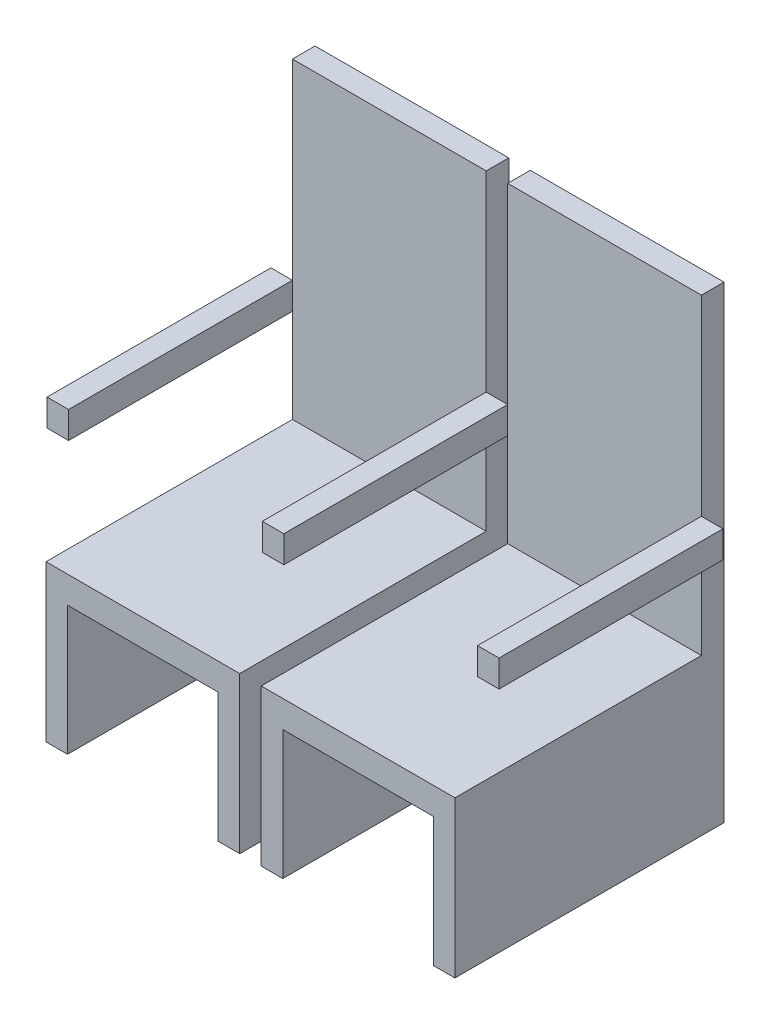
ISO-10303-21;
HEADER;
FILE_DESCRIPTION(('STEP AP214'),'2;1');
FILE_NAME('part.step','',(''),(''),'','','');
FILE_SCHEMA(('AUTOMOTIVE_DESIGN { 1 0 10303 214 1 1 1 1 }'));
ENDSEC;
DATA;
#1=APPLICATION_CONTEXT('core data for automotive mechanical design processes');
#2=APPLICATION_PROTOCOL_DEFINITION('international standard','automotive_design',2000,#1);
#3=PRODUCT_CONTEXT('',#1,'mechanical');
#4=PRODUCT('Part','Part','',(#3));
#5=PRODUCT_RELATED_PRODUCT_CATEGORY('part','',(#4));
#6=PRODUCT_DEFINITION_FORMATION('','',#4);
#7=PRODUCT_DEFINITION_CONTEXT('part definition',#1,'design');
#8=PRODUCT_DEFINITION('design','',#6,#7);
#9=PRODUCT_DEFINITION_SHAPE('','',#8);
#10=(LENGTH_UNIT() NAMED_UNIT(*) SI_UNIT(.MILLI.,.METRE.));
#11=(NAMED_UNIT(*) PLANE_ANGLE_UNIT() SI_UNIT($,.RADIAN.));
#12=(NAMED_UNIT(*) SI_UNIT($,.STERADIAN.) SOLID_ANGLE_UNIT());
#13=UNCERTAINTY_MEASURE_WITH_UNIT(LENGTH_MEASURE(1.E-05),#10,'distance_accuracy_value','');
#14=(GEOMETRIC_REPRESENTATION_CONTEXT(3) GLOBAL_UNCERTAINTY_ASSIGNED_CONTEXT((#13)) GLOBAL_UNIT_ASSIGNED_CONTEXT((#10,
#11,#12)) REPRESENTATION_CONTEXT('',''));
#15=CARTESIAN_POINT('',(0.,0.,0.));
#16=DIRECTION('',(0.,0.,1.));
#17=DIRECTION('',(1.,0.,0.));
#18=AXIS2_PLACEMENT_3D('',#15,#16,#17);
#19=CARTESIAN_POINT('',(0.,0.,-264.16));
#20=DIRECTION('',(0.,0.,-1.));
#21=DIRECTION('',(-1.,0.,0.));
#22=AXIS2_PLACEMENT_3D('',#19,#20,#21);
#23=PLANE('',#22);
#24=DIRECTION('',(0.,-1.,0.));
#25=VECTOR('',#24,1.);
#26=CARTESIAN_POINT('',(-25.4,589.28,-264.16));
#27=LINE('',#26,#25);
#28=CARTESIAN_POINT('',(-25.4,652.78,-264.16));
#29=VERTEX_POINT('',#28);
#30=CARTESIAN_POINT('',(-25.4,589.28,-264.16));
#31=VERTEX_POINT('',#30);
#32=EDGE_CURVE('E93',#29,#31,#27,.T.);
#33=ORIENTED_EDGE('',*,*,#32,.F.);
#34=DIRECTION('',(-1.,0.,0.));
#35=VECTOR('',#34,1.);
#36=CARTESIAN_POINT('',(-25.4,652.78,-264.16));
#37=LINE('',#36,#35);
#38=CARTESIAN_POINT('',(25.4,652.78,-264.16));
#39=VERTEX_POINT('',#38);
#40=EDGE_CURVE('E104',#39,#29,#37,.T.);
#41=ORIENTED_EDGE('',*,*,#40,.F.);
#42=DIRECTION('',(0.,1.,0.));
#43=VECTOR('',#42,1.);
#44=CARTESIAN_POINT('',(25.4,589.28,-264.16));
#45=LINE('',#44,#43);
#46=CARTESIAN_POINT('',(25.4,589.28,-264.16));
#47=VERTEX_POINT('',#46);
#48=EDGE_CURVE('E95',#47,#39,#45,.T.);
#49=ORIENTED_EDGE('',*,*,#48,.F.);
#50=DIRECTION('',(1.,0.,0.));
#51=VECTOR('',#50,1.);
#52=CARTESIAN_POINT('',(-25.4,589.28,-264.16));
#53=LINE('',#52,#51);
#54=EDGE_CURVE('E85',#31,#47,#53,.T.);
#55=ORIENTED_EDGE('',*,*,#54,.F.);
#56=EDGE_LOOP('',(#33,#41,#49,#55));
#57=FACE_BOUND('',#56,.T.);
#58=ADVANCED_FACE('F43',(#57),#23,.T.);
#59=CARTESIAN_POINT('',(-25.4,652.78,345.479677815397));
#60=DIRECTION('',(0.,-1.,0.));
#61=DIRECTION('',(0.,0.,-1.));
#62=AXIS2_PLACEMENT_3D('',#59,#60,#61);
#63=PLANE('',#62);
#64=DIRECTION('',(0.,0.,-1.));
#65=VECTOR('',#64,1.);
#66=CARTESIAN_POINT('',(-25.4,652.78,345.479677815397));
#67=LINE('',#66,#65);
#68=CARTESIAN_POINT('',(-25.4,652.78,264.16));
#69=VERTEX_POINT('',#68);
#70=EDGE_CURVE('E98',#69,#29,#67,.T.);
#71=ORIENTED_EDGE('',*,*,#70,.F.);
#72=DIRECTION('',(1.,0.,0.));
#73=VECTOR('',#72,1.);
#74=CARTESIAN_POINT('',(-25.4,652.78,264.16));
#75=LINE('',#74,#73);
#76=CARTESIAN_POINT('',(25.4,652.78,264.16));
#77=VERTEX_POINT('',#76);
#78=EDGE_CURVE('E47',#69,#77,#75,.T.);
#79=ORIENTED_EDGE('',*,*,#78,.T.);
#80=DIRECTION('',(0.,0.,-1.));
#81=VECTOR('',#80,1.);
#82=CARTESIAN_POINT('',(25.4,652.78,345.479677815397));
#83=LINE('',#82,#81);
#84=EDGE_CURVE('E107',#77,#39,#83,.T.);
#85=ORIENTED_EDGE('',*,*,#84,.T.);
#86=ORIENTED_EDGE('',*,*,#40,.T.);
#87=EDGE_LOOP('',(#71,#79,#85,#86));
#88=FACE_BOUND('',#87,.T.);
#89=ADVANCED_FACE('F116',(#88),#63,.F.);
#90=CARTESIAN_POINT('',(25.4,589.28,345.479677815397));
#91=DIRECTION('',(-1.,0.,0.));
#92=DIRECTION('',(0.,0.,1.));
#93=AXIS2_PLACEMENT_3D('',#90,#91,#92);
#94=PLANE('',#93);
#95=ORIENTED_EDGE('',*,*,#84,.F.);
#96=DIRECTION('',(0.,-1.,0.));
#97=VECTOR('',#96,1.);
#98=CARTESIAN_POINT('',(25.4,589.28,264.159999999999));
#99=LINE('',#98,#97);
#100=CARTESIAN_POINT('',(25.4,589.28,264.159999999999));
#101=VERTEX_POINT('',#100);
#102=EDGE_CURVE('E113',#77,#101,#99,.T.);
#103=ORIENTED_EDGE('',*,*,#102,.T.);
#104=DIRECTION('',(0.,0.,-1.));
#105=VECTOR('',#104,1.);
#106=CARTESIAN_POINT('',(25.4,589.28,345.479677815397));
#107=LINE('',#106,#105);
#108=EDGE_CURVE('E89',#101,#47,#107,.T.);
#109=ORIENTED_EDGE('',*,*,#108,.T.);
#110=ORIENTED_EDGE('',*,*,#48,.T.);
#111=EDGE_LOOP('',(#95,#103,#109,#110));
#112=FACE_BOUND('',#111,.T.);
#113=ADVANCED_FACE('F112',(#112),#94,.F.);
#114=CARTESIAN_POINT('',(-25.4,589.28,345.479677815397));
#115=DIRECTION('',(0.,1.,0.));
#116=DIRECTION('',(0.,0.,1.));
#117=AXIS2_PLACEMENT_3D('',#114,#115,#116);
#118=PLANE('',#117);
#119=ORIENTED_EDGE('',*,*,#108,.F.);
#120=DIRECTION('',(-1.,0.,0.));
#121=VECTOR('',#120,1.);
#122=CARTESIAN_POINT('',(-25.4,589.28,264.16));
#123=LINE('',#122,#121);
#124=CARTESIAN_POINT('',(-25.4,589.28,264.16));
#125=VERTEX_POINT('',#124);
#126=EDGE_CURVE('E52',#101,#125,#123,.T.);
#127=ORIENTED_EDGE('',*,*,#126,.T.);
#128=DIRECTION('',(0.,0.,-1.));
#129=VECTOR('',#128,1.);
#130=CARTESIAN_POINT('',(-25.4,589.28,345.479677815397));
#131=LINE('',#130,#129);
#132=EDGE_CURVE('E82',#125,#31,#131,.T.);
#133=ORIENTED_EDGE('',*,*,#132,.T.);
#134=ORIENTED_EDGE('',*,*,#54,.T.);
#135=EDGE_LOOP('',(#119,#127,#133,#134));
#136=FACE_BOUND('',#135,.T.);
#137=ADVANCED_FACE('F84',(#136),#118,.F.);
#138=CARTESIAN_POINT('',(-25.4,589.28,345.479677815397));
#139=DIRECTION('',(1.,0.,0.));
#140=DIRECTION('',(0.,0.,-1.));
#141=AXIS2_PLACEMENT_3D('',#138,#139,#140);
#142=PLANE('',#141);
#143=ORIENTED_EDGE('',*,*,#132,.F.);
#144=DIRECTION('',(0.,1.,0.));
#145=VECTOR('',#144,1.);
#146=CARTESIAN_POINT('',(-25.4,589.28,264.16));
#147=LINE('',#146,#145);
#148=EDGE_CURVE('E12',#125,#69,#147,.T.);
#149=ORIENTED_EDGE('',*,*,#148,.T.);
#150=ORIENTED_EDGE('',*,*,#70,.T.);
#151=ORIENTED_EDGE('',*,*,#32,.T.);
#152=EDGE_LOOP('',(#143,#149,#150,#151));
#153=FACE_BOUND('',#152,.T.);
#154=ADVANCED_FACE('F45',(#153),#142,.F.);
#155=CARTESIAN_POINT('',(-533.4,368.3,264.16));
#156=DIRECTION('',(0.,0.,-1.));
#157=DIRECTION('',(-1.,0.,0.));
#158=AXIS2_PLACEMENT_3D('',#155,#156,#157);
#159=PLANE('',#158);
#160=ORIENTED_EDGE('',*,*,#126,.F.);
#161=ORIENTED_EDGE('',*,*,#102,.F.);
#162=ORIENTED_EDGE('',*,*,#78,.F.);
#163=ORIENTED_EDGE('',*,*,#148,.F.);
#164=EDGE_LOOP('',(#160,#161,#162,#163));
#165=FACE_BOUND('',#164,.T.);
#166=ADVANCED_FACE('F130',(#165),#159,.F.);
#167=CLOSED_SHELL('',(#58,#89,#113,#137,#154,#166));
#168=MANIFOLD_SOLID_BREP('B2',#167);
#169=CARTESIAN_POINT('',(0.,0.,-264.16));
#170=DIRECTION('',(0.,0.,-1.));
#171=DIRECTION('',(-1.,0.,0.));
#172=AXIS2_PLACEMENT_3D('',#169,#170,#171);
#173=PLANE('',#172);
#174=DIRECTION('',(0.,-1.,0.));
#175=VECTOR('',#174,1.);
#176=CARTESIAN_POINT('',(482.6,589.28,-264.16));
#177=LINE('',#176,#175);
#178=CARTESIAN_POINT('',(482.6,652.78,-264.16));
#179=VERTEX_POINT('',#178);
#180=CARTESIAN_POINT('',(482.6,589.28,-264.16));
#181=VERTEX_POINT('',#180);
#182=EDGE_CURVE('E226',#179,#181,#177,.T.);
#183=ORIENTED_EDGE('',*,*,#182,.F.);
#184=DIRECTION('',(-1.,0.,0.));
#185=VECTOR('',#184,1.);
#186=CARTESIAN_POINT('',(482.6,652.78,-264.16));
#187=LINE('',#186,#185);
#188=CARTESIAN_POINT('',(533.4,652.78,-264.16));
#189=VERTEX_POINT('',#188);
#190=EDGE_CURVE('E237',#189,#179,#187,.T.);
#191=ORIENTED_EDGE('',*,*,#190,.F.);
#192=DIRECTION('',(0.,1.,0.));
#193=VECTOR('',#192,1.);
#194=CARTESIAN_POINT('',(533.4,589.28,-264.16));
#195=LINE('',#194,#193);
#196=CARTESIAN_POINT('',(533.4,589.28,-264.16));
#197=VERTEX_POINT('',#196);
#198=EDGE_CURVE('E228',#197,#189,#195,.T.);
#199=ORIENTED_EDGE('',*,*,#198,.F.);
#200=DIRECTION('',(1.,0.,0.));
#201=VECTOR('',#200,1.);
#202=CARTESIAN_POINT('',(482.6,589.28,-264.16));
#203=LINE('',#202,#201);
#204=EDGE_CURVE('E218',#181,#197,#203,.T.);
#205=ORIENTED_EDGE('',*,*,#204,.F.);
#206=EDGE_LOOP('',(#183,#191,#199,#205));
#207=FACE_BOUND('',#206,.T.);
#208=ADVANCED_FACE('F176',(#207),#173,.T.);
#209=CARTESIAN_POINT('',(482.6,652.78,345.479677815397));
#210=DIRECTION('',(0.,-1.,0.));
#211=DIRECTION('',(0.,0.,-1.));
#212=AXIS2_PLACEMENT_3D('',#209,#210,#211);
#213=PLANE('',#212);
#214=DIRECTION('',(0.,0.,-1.));
#215=VECTOR('',#214,1.);
#216=CARTESIAN_POINT('',(482.6,652.78,345.479677815397));
#217=LINE('',#216,#215);
#218=CARTESIAN_POINT('',(482.6,652.78,264.159999999999));
#219=VERTEX_POINT('',#218);
#220=EDGE_CURVE('E231',#219,#179,#217,.T.);
#221=ORIENTED_EDGE('',*,*,#220,.F.);
#222=DIRECTION('',(1.,0.,0.));
#223=VECTOR('',#222,1.);
#224=CARTESIAN_POINT('',(482.6,652.78,264.159999999999));
#225=LINE('',#224,#223);
#226=CARTESIAN_POINT('',(533.4,652.78,264.159999999999));
#227=VERTEX_POINT('',#226);
#228=EDGE_CURVE('E180',#219,#227,#225,.T.);
#229=ORIENTED_EDGE('',*,*,#228,.T.);
#230=DIRECTION('',(0.,0.,-1.));
#231=VECTOR('',#230,1.);
#232=CARTESIAN_POINT('',(533.4,652.78,345.479677815397));
#233=LINE('',#232,#231);
#234=EDGE_CURVE('E240',#227,#189,#233,.T.);
#235=ORIENTED_EDGE('',*,*,#234,.T.);
#236=ORIENTED_EDGE('',*,*,#190,.T.);
#237=EDGE_LOOP('',(#221,#229,#235,#236));
#238=FACE_BOUND('',#237,.T.);
#239=ADVANCED_FACE('F249',(#238),#213,.F.);
#240=CARTESIAN_POINT('',(533.4,589.28,345.479677815397));
#241=DIRECTION('',(-1.,0.,0.));
#242=DIRECTION('',(0.,0.,1.));
#243=AXIS2_PLACEMENT_3D('',#240,#241,#242);
#244=PLANE('',#243);
#245=ORIENTED_EDGE('',*,*,#234,.F.);
#246=DIRECTION('',(0.,-1.,0.));
#247=VECTOR('',#246,1.);
#248=CARTESIAN_POINT('',(533.4,589.28,264.159999999999));
#249=LINE('',#248,#247);
#250=CARTESIAN_POINT('',(533.4,589.28,264.159999999999));
#251=VERTEX_POINT('',#250);
#252=EDGE_CURVE('E246',#227,#251,#249,.T.);
#253=ORIENTED_EDGE('',*,*,#252,.T.);
#254=DIRECTION('',(0.,0.,-1.));
#255=VECTOR('',#254,1.);
#256=CARTESIAN_POINT('',(533.4,589.28,345.479677815397));
#257=LINE('',#256,#255);
#258=EDGE_CURVE('E222',#251,#197,#257,.T.);
#259=ORIENTED_EDGE('',*,*,#258,.T.);
#260=ORIENTED_EDGE('',*,*,#198,.T.);
#261=EDGE_LOOP('',(#245,#253,#259,#260));
#262=FACE_BOUND('',#261,.T.);
#263=ADVANCED_FACE('F245',(#262),#244,.F.);
#264=CARTESIAN_POINT('',(482.6,589.28,345.479677815397));
#265=DIRECTION('',(0.,1.,0.));
#266=DIRECTION('',(0.,0.,1.));
#267=AXIS2_PLACEMENT_3D('',#264,#265,#266);
#268=PLANE('',#267);
#269=ORIENTED_EDGE('',*,*,#258,.F.);
#270=DIRECTION('',(-1.,0.,0.));
#271=VECTOR('',#270,1.);
#272=CARTESIAN_POINT('',(482.6,589.28,264.159999999999));
#273=LINE('',#272,#271);
#274=CARTESIAN_POINT('',(482.6,589.28,264.159999999999));
#275=VERTEX_POINT('',#274);
#276=EDGE_CURVE('E185',#251,#275,#273,.T.);
#277=ORIENTED_EDGE('',*,*,#276,.T.);
#278=DIRECTION('',(0.,0.,-1.));
#279=VECTOR('',#278,1.);
#280=CARTESIAN_POINT('',(482.6,589.28,345.479677815397));
#281=LINE('',#280,#279);
#282=EDGE_CURVE('E215',#275,#181,#281,.T.);
#283=ORIENTED_EDGE('',*,*,#282,.T.);
#284=ORIENTED_EDGE('',*,*,#204,.T.);
#285=EDGE_LOOP('',(#269,#277,#283,#284));
#286=FACE_BOUND('',#285,.T.);
#287=ADVANCED_FACE('F217',(#286),#268,.F.);
#288=CARTESIAN_POINT('',(482.6,589.28,345.479677815397));
#289=DIRECTION('',(1.,0.,0.));
#290=DIRECTION('',(0.,0.,-1.));
#291=AXIS2_PLACEMENT_3D('',#288,#289,#290);
#292=PLANE('',#291);
#293=ORIENTED_EDGE('',*,*,#282,.F.);
#294=DIRECTION('',(0.,1.,0.));
#295=VECTOR('',#294,1.);
#296=CARTESIAN_POINT('',(482.6,589.28,264.159999999999));
#297=LINE('',#296,#295);
#298=EDGE_CURVE('E41',#275,#219,#297,.T.);
#299=ORIENTED_EDGE('',*,*,#298,.T.);
#300=ORIENTED_EDGE('',*,*,#220,.T.);
#301=ORIENTED_EDGE('',*,*,#182,.T.);
#302=EDGE_LOOP('',(#293,#299,#300,#301));
#303=FACE_BOUND('',#302,.T.);
#304=ADVANCED_FACE('F178',(#303),#292,.F.);
#305=CARTESIAN_POINT('',(-533.4,368.3,264.16));
#306=DIRECTION('',(0.,0.,-1.));
#307=DIRECTION('',(-1.,0.,0.));
#308=AXIS2_PLACEMENT_3D('',#305,#306,#307);
#309=PLANE('',#308);
#310=ORIENTED_EDGE('',*,*,#276,.F.);
#311=ORIENTED_EDGE('',*,*,#252,.F.);
#312=ORIENTED_EDGE('',*,*,#228,.F.);
#313=ORIENTED_EDGE('',*,*,#298,.F.);
#314=EDGE_LOOP('',(#310,#311,#312,#313));
#315=FACE_BOUND('',#314,.T.);
#316=ADVANCED_FACE('F263',(#315),#309,.F.);
#317=CLOSED_SHELL('',(#208,#239,#263,#287,#304,#316));
#318=MANIFOLD_SOLID_BREP('B6',#317);
#319=CARTESIAN_POINT('',(0.,0.,-264.16));
#320=DIRECTION('',(0.,0.,1.));
#321=DIRECTION('',(1.,0.,0.));
#322=AXIS2_PLACEMENT_3D('',#319,#320,#321);
#323=PLANE('',#322);
#324=DIRECTION('',(0.,1.,0.));
#325=VECTOR('',#324,1.);
#326=CARTESIAN_POINT('',(-482.6,589.28,-264.16));
#327=LINE('',#326,#325);
#328=CARTESIAN_POINT('',(-482.6,589.28,-264.16));
#329=VERTEX_POINT('',#328);
#330=CARTESIAN_POINT('',(-482.6,652.78,-264.16));
#331=VERTEX_POINT('',#330);
#332=EDGE_CURVE('E359',#329,#331,#327,.T.);
#333=ORIENTED_EDGE('',*,*,#332,.F.);
#334=DIRECTION('',(1.,0.,0.));
#335=VECTOR('',#334,1.);
#336=CARTESIAN_POINT('',(-482.6,589.28,-264.16));
#337=LINE('',#336,#335);
#338=CARTESIAN_POINT('',(-533.4,589.28,-264.16));
#339=VERTEX_POINT('',#338);
#340=EDGE_CURVE('E370',#339,#329,#337,.T.);
#341=ORIENTED_EDGE('',*,*,#340,.F.);
#342=DIRECTION('',(0.,-1.,0.));
#343=VECTOR('',#342,1.);
#344=CARTESIAN_POINT('',(-533.4,589.28,-264.16));
#345=LINE('',#344,#343);
#346=CARTESIAN_POINT('',(-533.4,652.78,-264.16));
#347=VERTEX_POINT('',#346);
#348=EDGE_CURVE('E361',#347,#339,#345,.T.);
#349=ORIENTED_EDGE('',*,*,#348,.F.);
#350=DIRECTION('',(-1.,0.,0.));
#351=VECTOR('',#350,1.);
#352=CARTESIAN_POINT('',(-482.6,652.78,-264.16));
#353=LINE('',#352,#351);
#354=EDGE_CURVE('E351',#331,#347,#353,.T.);
#355=ORIENTED_EDGE('',*,*,#354,.F.);
#356=EDGE_LOOP('',(#333,#341,#349,#355));
#357=FACE_BOUND('',#356,.T.);
#358=ADVANCED_FACE('F309',(#357),#323,.F.);
#359=CARTESIAN_POINT('',(-482.6,589.28,345.479677815397));
#360=DIRECTION('',(0.,1.,0.));
#361=DIRECTION('',(0.,0.,1.));
#362=AXIS2_PLACEMENT_3D('',#359,#360,#361);
#363=PLANE('',#362);
#364=DIRECTION('',(0.,0.,-1.));
#365=VECTOR('',#364,1.);
#366=CARTESIAN_POINT('',(-482.6,589.28,345.479677815397));
#367=LINE('',#366,#365);
#368=CARTESIAN_POINT('',(-482.6,589.28,264.16));
#369=VERTEX_POINT('',#368);
#370=EDGE_CURVE('E364',#369,#329,#367,.T.);
#371=ORIENTED_EDGE('',*,*,#370,.F.);
#372=DIRECTION('',(-1.,0.,0.));
#373=VECTOR('',#372,1.);
#374=CARTESIAN_POINT('',(-482.6,589.28,264.16));
#375=LINE('',#374,#373);
#376=CARTESIAN_POINT('',(-533.4,589.28,264.16));
#377=VERTEX_POINT('',#376);
#378=EDGE_CURVE('E313',#369,#377,#375,.T.);
#379=ORIENTED_EDGE('',*,*,#378,.T.);
#380=DIRECTION('',(0.,0.,-1.));
#381=VECTOR('',#380,1.);
#382=CARTESIAN_POINT('',(-533.4,589.28,345.479677815397));
#383=LINE('',#382,#381);
#384=EDGE_CURVE('E373',#377,#339,#383,.T.);
#385=ORIENTED_EDGE('',*,*,#384,.T.);
#386=ORIENTED_EDGE('',*,*,#340,.T.);
#387=EDGE_LOOP('',(#371,#379,#385,#386));
#388=FACE_BOUND('',#387,.T.);
#389=ADVANCED_FACE('F382',(#388),#363,.F.);
#390=CARTESIAN_POINT('',(-533.4,589.28,345.479677815397));
#391=DIRECTION('',(1.,0.,0.));
#392=DIRECTION('',(0.,0.,-1.));
#393=AXIS2_PLACEMENT_3D('',#390,#391,#392);
#394=PLANE('',#393);
#395=ORIENTED_EDGE('',*,*,#384,.F.);
#396=DIRECTION('',(0.,1.,0.));
#397=VECTOR('',#396,1.);
#398=CARTESIAN_POINT('',(-533.4,589.28,264.16));
#399=LINE('',#398,#397);
#400=CARTESIAN_POINT('',(-533.4,652.78,264.16));
#401=VERTEX_POINT('',#400);
#402=EDGE_CURVE('E379',#377,#401,#399,.T.);
#403=ORIENTED_EDGE('',*,*,#402,.T.);
#404=DIRECTION('',(0.,0.,-1.));
#405=VECTOR('',#404,1.);
#406=CARTESIAN_POINT('',(-533.4,652.78,345.479677815397));
#407=LINE('',#406,#405);
#408=EDGE_CURVE('E355',#401,#347,#407,.T.);
#409=ORIENTED_EDGE('',*,*,#408,.T.);
#410=ORIENTED_EDGE('',*,*,#348,.T.);
#411=EDGE_LOOP('',(#395,#403,#409,#410));
#412=FACE_BOUND('',#411,.T.);
#413=ADVANCED_FACE('F378',(#412),#394,.F.);
#414=CARTESIAN_POINT('',(-482.6,652.78,345.479677815397));
#415=DIRECTION('',(0.,-1.,0.));
#416=DIRECTION('',(0.,0.,-1.));
#417=AXIS2_PLACEMENT_3D('',#414,#415,#416);
#418=PLANE('',#417);
#419=ORIENTED_EDGE('',*,*,#408,.F.);
#420=DIRECTION('',(1.,0.,0.));
#421=VECTOR('',#420,1.);
#422=CARTESIAN_POINT('',(-482.6,652.78,264.16));
#423=LINE('',#422,#421);
#424=CARTESIAN_POINT('',(-482.6,652.78,264.16));
#425=VERTEX_POINT('',#424);
#426=EDGE_CURVE('E318',#401,#425,#423,.T.);
#427=ORIENTED_EDGE('',*,*,#426,.T.);
#428=DIRECTION('',(0.,0.,-1.));
#429=VECTOR('',#428,1.);
#430=CARTESIAN_POINT('',(-482.6,652.78,345.479677815397));
#431=LINE('',#430,#429);
#432=EDGE_CURVE('E348',#425,#331,#431,.T.);
#433=ORIENTED_EDGE('',*,*,#432,.T.);
#434=ORIENTED_EDGE('',*,*,#354,.T.);
#435=EDGE_LOOP('',(#419,#427,#433,#434));
#436=FACE_BOUND('',#435,.T.);
#437=ADVANCED_FACE('F350',(#436),#418,.F.);
#438=CARTESIAN_POINT('',(-482.6,589.28,345.479677815397));
#439=DIRECTION('',(-1.,0.,0.));
#440=DIRECTION('',(0.,0.,1.));
#441=AXIS2_PLACEMENT_3D('',#438,#439,#440);
#442=PLANE('',#441);
#443=ORIENTED_EDGE('',*,*,#432,.F.);
#444=DIRECTION('',(0.,-1.,0.));
#445=VECTOR('',#444,1.);
#446=CARTESIAN_POINT('',(-482.6,589.28,264.16));
#447=LINE('',#446,#445);
#448=EDGE_CURVE('E174',#425,#369,#447,.T.);
#449=ORIENTED_EDGE('',*,*,#448,.T.);
#450=ORIENTED_EDGE('',*,*,#370,.T.);
#451=ORIENTED_EDGE('',*,*,#332,.T.);
#452=EDGE_LOOP('',(#443,#449,#450,#451));
#453=FACE_BOUND('',#452,.T.);
#454=ADVANCED_FACE('F311',(#453),#442,.F.);
#455=CARTESIAN_POINT('',(-533.4,368.3,264.16));
#456=DIRECTION('',(0.,0.,-1.));
#457=DIRECTION('',(-1.,0.,0.));
#458=AXIS2_PLACEMENT_3D('',#455,#456,#457);
#459=PLANE('',#458);
#460=ORIENTED_EDGE('',*,*,#426,.F.);
#461=ORIENTED_EDGE('',*,*,#402,.F.);
#462=ORIENTED_EDGE('',*,*,#378,.F.);
#463=ORIENTED_EDGE('',*,*,#448,.F.);
#464=EDGE_LOOP('',(#460,#461,#462,#463));
#465=FACE_BOUND('',#464,.T.);
#466=ADVANCED_FACE('F396',(#465),#459,.F.);
#467=CLOSED_SHELL('',(#358,#389,#413,#437,#454,#466));
#468=MANIFOLD_SOLID_BREP('B35',#467);
#469=CARTESIAN_POINT('',(0.,0.,0.));
#470=DIRECTION('',(0.,-1.,0.));
#471=DIRECTION('',(0.,0.,-1.));
#472=AXIS2_PLACEMENT_3D('',#469,#470,#471);
#473=PLANE('',#472);
#474=DIRECTION('',(0.,0.,1.));
#475=VECTOR('',#474,1.);
#476=CARTESIAN_POINT('',(76.1999999999999,0.,-317.5));
#477=LINE('',#476,#475);
#478=CARTESIAN_POINT('',(76.1999999999999,0.,-317.5));
#479=VERTEX_POINT('',#478);
#480=CARTESIAN_POINT('',(76.1999999999999,0.,317.5));
#481=VERTEX_POINT('',#480);
#482=EDGE_CURVE('E521',#479,#481,#477,.T.);
#483=ORIENTED_EDGE('',*,*,#482,.T.);
#484=DIRECTION('',(1.,0.,0.));
#485=VECTOR('',#484,1.);
#486=CARTESIAN_POINT('',(25.4,0.,317.5));
#487=LINE('',#486,#485);
#488=CARTESIAN_POINT('',(25.4,0.,317.5));
#489=VERTEX_POINT('',#488);
#490=EDGE_CURVE('E550',#489,#481,#487,.T.);
#491=ORIENTED_EDGE('',*,*,#490,.F.);
#492=DIRECTION('',(0.,0.,1.));
#493=VECTOR('',#492,1.);
#494=CARTESIAN_POINT('',(25.4,0.,317.5));
#495=LINE('',#494,#493);
#496=CARTESIAN_POINT('',(25.4,0.,-317.5));
#497=VERTEX_POINT('',#496);
#498=EDGE_CURVE('E543',#497,#489,#495,.T.);
#499=ORIENTED_EDGE('',*,*,#498,.F.);
#500=DIRECTION('',(-1.,0.,0.));
#501=VECTOR('',#500,1.);
#502=CARTESIAN_POINT('',(25.4,0.,-317.5));
#503=LINE('',#502,#501);
#504=EDGE_CURVE('E537',#479,#497,#503,.T.);
#505=ORIENTED_EDGE('',*,*,#504,.F.);
#506=EDGE_LOOP('',(#483,#491,#499,#505));
#507=FACE_BOUND('',#506,.T.);
#508=ADVANCED_FACE('F442',(#507),#473,.T.);
#509=CARTESIAN_POINT('',(0.,368.3,0.));
#510=DIRECTION('',(0.,-1.,0.));
#511=DIRECTION('',(0.,0.,-1.));
#512=AXIS2_PLACEMENT_3D('',#509,#510,#511);
#513=PLANE('',#512);
#514=DIRECTION('',(0.,0.,-1.));
#515=VECTOR('',#514,1.);
#516=CARTESIAN_POINT('',(482.6,368.3,264.16));
#517=LINE('',#516,#515);
#518=CARTESIAN_POINT('',(482.6,368.3,317.5));
#519=VERTEX_POINT('',#518);
#520=CARTESIAN_POINT('',(482.6,368.3,-264.16));
#521=VERTEX_POINT('',#520);
#522=EDGE_CURVE('E557',#519,#521,#517,.T.);
#523=ORIENTED_EDGE('',*,*,#522,.T.);
#524=DIRECTION('',(1.,0.,0.));
#525=VECTOR('',#524,1.);
#526=CARTESIAN_POINT('',(482.6,368.3,-264.16));
#527=LINE('',#526,#525);
#528=CARTESIAN_POINT('',(25.4,368.3,-264.16));
#529=VERTEX_POINT('',#528);
#530=EDGE_CURVE('E586',#529,#521,#527,.T.);
#531=ORIENTED_EDGE('',*,*,#530,.F.);
#532=DIRECTION('',(0.,0.,1.));
#533=VECTOR('',#532,1.);
#534=CARTESIAN_POINT('',(25.4,368.3,317.5));
#535=LINE('',#534,#533);
#536=CARTESIAN_POINT('',(25.4,368.3,317.5));
#537=VERTEX_POINT('',#536);
#538=EDGE_CURVE('E548',#529,#537,#535,.T.);
#539=ORIENTED_EDGE('',*,*,#538,.T.);
#540=DIRECTION('',(1.,0.,0.));
#541=VECTOR('',#540,1.);
#542=CARTESIAN_POINT('',(25.4,368.3,317.5));
#543=LINE('',#542,#541);
#544=EDGE_CURVE('E569',#537,#519,#543,.T.);
#545=ORIENTED_EDGE('',*,*,#544,.T.);
#546=EDGE_LOOP('',(#523,#531,#539,#545));
#547=FACE_BOUND('',#546,.T.);
#548=ADVANCED_FACE('F622',(#547),#513,.F.);
#549=CARTESIAN_POINT('',(25.4,368.3,317.5));
#550=DIRECTION('',(1.,0.,0.));
#551=DIRECTION('',(0.,0.,-1.));
#552=AXIS2_PLACEMENT_3D('',#549,#550,#551);
#553=PLANE('',#552);
#554=ORIENTED_EDGE('',*,*,#498,.T.);
#555=DIRECTION('',(0.,-1.,0.));
#556=VECTOR('',#555,1.);
#557=CARTESIAN_POINT('',(25.4,368.3,317.5));
#558=LINE('',#557,#556);
#559=EDGE_CURVE('E307',#537,#489,#558,.T.);
#560=ORIENTED_EDGE('',*,*,#559,.F.);
#561=ORIENTED_EDGE('',*,*,#538,.F.);
#562=DIRECTION('',(0.,-1.,0.));
#563=VECTOR('',#562,1.);
#564=CARTESIAN_POINT('',(25.4,1104.9,-264.16));
#565=LINE('',#564,#563);
#566=CARTESIAN_POINT('',(25.4,1104.9,-264.16));
#567=VERTEX_POINT('',#566);
#568=EDGE_CURVE('E465',#567,#529,#565,.T.);
#569=ORIENTED_EDGE('',*,*,#568,.F.);
#570=DIRECTION('',(0.,0.,1.));
#571=VECTOR('',#570,1.);
#572=CARTESIAN_POINT('',(25.4,1104.9,-264.16));
#573=LINE('',#572,#571);
#574=CARTESIAN_POINT('',(25.4,1104.9,-317.5));
#575=VERTEX_POINT('',#574);
#576=EDGE_CURVE('E591',#575,#567,#573,.T.);
#577=ORIENTED_EDGE('',*,*,#576,.F.);
#578=DIRECTION('',(0.,-1.,0.));
#579=VECTOR('',#578,1.);
#580=CARTESIAN_POINT('',(25.4,368.3,-317.5));
#581=LINE('',#580,#579);
#582=EDGE_CURVE('E554',#575,#497,#581,.T.);
#583=ORIENTED_EDGE('',*,*,#582,.T.);
#584=EDGE_LOOP('',(#554,#560,#561,#569,#577,#583));
#585=FACE_BOUND('',#584,.T.);
#586=ADVANCED_FACE('F444',(#585),#553,.F.);
#587=CARTESIAN_POINT('',(25.4,368.3,317.5));
#588=DIRECTION('',(0.,0.,-1.));
#589=DIRECTION('',(-1.,0.,0.));
#590=AXIS2_PLACEMENT_3D('',#587,#588,#589);
#591=PLANE('',#590);
#592=ORIENTED_EDGE('',*,*,#490,.T.);
#593=DIRECTION('',(0.,1.,0.));
#594=VECTOR('',#593,1.);
#595=CARTESIAN_POINT('',(76.2,368.3,317.5));
#596=LINE('',#595,#594);
#597=CARTESIAN_POINT('',(76.2,304.8,317.5));
#598=VERTEX_POINT('',#597);
#599=EDGE_CURVE('E528',#481,#598,#596,.T.);
#600=ORIENTED_EDGE('',*,*,#599,.T.);
#601=DIRECTION('',(1.,0.,0.));
#602=VECTOR('',#601,1.);
#603=CARTESIAN_POINT('',(25.4,304.8,317.5));
#604=LINE('',#603,#602);
#605=CARTESIAN_POINT('',(431.8,304.8,317.5));
#606=VERTEX_POINT('',#605);
#607=EDGE_CURVE('E589',#598,#606,#604,.T.);
#608=ORIENTED_EDGE('',*,*,#607,.T.);
#609=DIRECTION('',(0.,-1.,0.));
#610=VECTOR('',#609,1.);
#611=CARTESIAN_POINT('',(431.8,368.3,317.5));
#612=LINE('',#611,#610);
#613=CARTESIAN_POINT('',(431.8,0.,317.5));
#614=VERTEX_POINT('',#613);
#615=EDGE_CURVE('E575',#606,#614,#612,.T.);
#616=ORIENTED_EDGE('',*,*,#615,.T.);
#617=CARTESIAN_POINT('',(482.6,0.,317.5));
#618=VERTEX_POINT('',#617);
#619=EDGE_CURVE('E573',#614,#618,#487,.T.);
#620=ORIENTED_EDGE('',*,*,#619,.T.);
#621=DIRECTION('',(0.,-1.,0.));
#622=VECTOR('',#621,1.);
#623=CARTESIAN_POINT('',(482.6,368.3,317.5));
#624=LINE('',#623,#622);
#625=EDGE_CURVE('E450',#519,#618,#624,.T.);
#626=ORIENTED_EDGE('',*,*,#625,.F.);
#627=ORIENTED_EDGE('',*,*,#544,.F.);
#628=ORIENTED_EDGE('',*,*,#559,.T.);
#629=EDGE_LOOP('',(#592,#600,#608,#616,#620,#626,#627,#628));
#630=FACE_BOUND('',#629,.T.);
#631=ADVANCED_FACE('F568',(#630),#591,.F.);
#632=CARTESIAN_POINT('',(482.6,368.3,-264.16));
#633=DIRECTION('',(-1.,0.,0.));
#634=DIRECTION('',(0.,0.,1.));
#635=AXIS2_PLACEMENT_3D('',#632,#633,#634);
#636=PLANE('',#635);
#637=DIRECTION('',(0.,-1.,0.));
#638=VECTOR('',#637,1.);
#639=CARTESIAN_POINT('',(482.6,1104.9,-264.16));
#640=LINE('',#639,#638);
#641=CARTESIAN_POINT('',(482.6,1104.9,-264.16));
#642=VERTEX_POINT('',#641);
#643=EDGE_CURVE('E583',#642,#521,#640,.T.);
#644=ORIENTED_EDGE('',*,*,#643,.T.);
#645=ORIENTED_EDGE('',*,*,#522,.F.);
#646=ORIENTED_EDGE('',*,*,#625,.T.);
#647=DIRECTION('',(0.,0.,-1.));
#648=VECTOR('',#647,1.);
#649=CARTESIAN_POINT('',(482.6,0.,-264.16));
#650=LINE('',#649,#648);
#651=CARTESIAN_POINT('',(482.6,0.,-317.5));
#652=VERTEX_POINT('',#651);
#653=EDGE_CURVE('E545',#618,#652,#650,.T.);
#654=ORIENTED_EDGE('',*,*,#653,.T.);
#655=DIRECTION('',(0.,-1.,0.));
#656=VECTOR('',#655,1.);
#657=CARTESIAN_POINT('',(482.6,368.3,-317.5));
#658=LINE('',#657,#656);
#659=CARTESIAN_POINT('',(482.6,1104.9,-317.5));
#660=VERTEX_POINT('',#659);
#661=EDGE_CURVE('E556',#660,#652,#658,.T.);
#662=ORIENTED_EDGE('',*,*,#661,.F.);
#663=DIRECTION('',(0.,0.,-1.));
#664=VECTOR('',#663,1.);
#665=CARTESIAN_POINT('',(482.6,1104.9,-264.16));
#666=LINE('',#665,#664);
#667=EDGE_CURVE('E588',#642,#660,#666,.T.);
#668=ORIENTED_EDGE('',*,*,#667,.F.);
#669=EDGE_LOOP('',(#644,#645,#646,#654,#662,#668));
#670=FACE_BOUND('',#669,.T.);
#671=ADVANCED_FACE('F563',(#670),#636,.F.);
#672=CARTESIAN_POINT('',(25.4,368.3,-317.5));
#673=DIRECTION('',(0.,0.,1.));
#674=DIRECTION('',(1.,0.,0.));
#675=AXIS2_PLACEMENT_3D('',#672,#673,#674);
#676=PLANE('',#675);
#677=DIRECTION('',(-1.,0.,0.));
#678=VECTOR('',#677,1.);
#679=CARTESIAN_POINT('',(76.2,304.8,-317.5));
#680=LINE('',#679,#678);
#681=CARTESIAN_POINT('',(431.8,304.8,-317.5));
#682=VERTEX_POINT('',#681);
#683=CARTESIAN_POINT('',(76.2,304.8,-317.5));
#684=VERTEX_POINT('',#683);
#685=EDGE_CURVE('E533',#682,#684,#680,.T.);
#686=ORIENTED_EDGE('',*,*,#685,.T.);
#687=DIRECTION('',(0.,-1.,0.));
#688=VECTOR('',#687,1.);
#689=CARTESIAN_POINT('',(76.1999999999999,0.,-317.5));
#690=LINE('',#689,#688);
#691=EDGE_CURVE('E525',#684,#479,#690,.T.);
#692=ORIENTED_EDGE('',*,*,#691,.T.);
#693=ORIENTED_EDGE('',*,*,#504,.T.);
#694=ORIENTED_EDGE('',*,*,#582,.F.);
#695=DIRECTION('',(-1.,0.,0.));
#696=VECTOR('',#695,1.);
#697=CARTESIAN_POINT('',(482.6,1104.9,-317.5));
#698=LINE('',#697,#696);
#699=EDGE_CURVE('E593',#660,#575,#698,.T.);
#700=ORIENTED_EDGE('',*,*,#699,.F.);
#701=ORIENTED_EDGE('',*,*,#661,.T.);
#702=CARTESIAN_POINT('',(431.8,0.,-317.5));
#703=VERTEX_POINT('',#702);
#704=EDGE_CURVE('E544',#652,#703,#503,.T.);
#705=ORIENTED_EDGE('',*,*,#704,.T.);
#706=DIRECTION('',(0.,1.,0.));
#707=VECTOR('',#706,1.);
#708=CARTESIAN_POINT('',(431.8,0.,-317.5));
#709=LINE('',#708,#707);
#710=EDGE_CURVE('E457',#703,#682,#709,.T.);
#711=ORIENTED_EDGE('',*,*,#710,.T.);
#712=EDGE_LOOP('',(#686,#692,#693,#694,#700,#701,#705,#711));
#713=FACE_BOUND('',#712,.T.);
#714=ADVANCED_FACE('F536',(#713),#676,.F.);
#715=DIRECTION('',(0.,0.,1.));
#716=VECTOR('',#715,1.);
#717=CARTESIAN_POINT('',(431.8,0.,-317.5));
#718=LINE('',#717,#716);
#719=EDGE_CURVE('E532',#703,#614,#718,.T.);
#720=ORIENTED_EDGE('',*,*,#719,.F.);
#721=ORIENTED_EDGE('',*,*,#704,.F.);
#722=ORIENTED_EDGE('',*,*,#653,.F.);
#723=ORIENTED_EDGE('',*,*,#619,.F.);
#724=EDGE_LOOP('',(#720,#721,#722,#723));
#725=FACE_BOUND('',#724,.T.);
#726=ADVANCED_FACE('F609',(#725),#473,.T.);
#727=CARTESIAN_POINT('',(482.6,1104.9,-264.16));
#728=DIRECTION('',(0.,0.,-1.));
#729=DIRECTION('',(-1.,0.,0.));
#730=AXIS2_PLACEMENT_3D('',#727,#728,#729);
#731=PLANE('',#730);
#732=ORIENTED_EDGE('',*,*,#530,.T.);
#733=ORIENTED_EDGE('',*,*,#643,.F.);
#734=DIRECTION('',(1.,0.,0.));
#735=VECTOR('',#734,1.);
#736=CARTESIAN_POINT('',(482.6,1104.9,-264.16));
#737=LINE('',#736,#735);
#738=EDGE_CURVE('E585',#567,#642,#737,.T.);
#739=ORIENTED_EDGE('',*,*,#738,.F.);
#740=ORIENTED_EDGE('',*,*,#568,.T.);
#741=EDGE_LOOP('',(#732,#733,#739,#740));
#742=FACE_BOUND('',#741,.T.);
#743=ADVANCED_FACE('F620',(#742),#731,.F.);
#744=CARTESIAN_POINT('',(0.,1104.9,0.));
#745=DIRECTION('',(0.,1.,0.));
#746=DIRECTION('',(0.,0.,1.));
#747=AXIS2_PLACEMENT_3D('',#744,#745,#746);
#748=PLANE('',#747);
#749=ORIENTED_EDGE('',*,*,#667,.T.);
#750=ORIENTED_EDGE('',*,*,#699,.T.);
#751=ORIENTED_EDGE('',*,*,#576,.T.);
#752=ORIENTED_EDGE('',*,*,#738,.T.);
#753=EDGE_LOOP('',(#749,#750,#751,#752));
#754=FACE_BOUND('',#753,.T.);
#755=ADVANCED_FACE('F617',(#754),#748,.T.);
#756=CARTESIAN_POINT('',(76.2,304.8,-317.5));
#757=DIRECTION('',(0.,1.,0.));
#758=DIRECTION('',(-1.,0.,0.));
#759=AXIS2_PLACEMENT_3D('',#756,#757,#758);
#760=PLANE('',#759);
#761=DIRECTION('',(0.,0.,1.));
#762=VECTOR('',#761,1.);
#763=CARTESIAN_POINT('',(76.2,304.8,-317.5));
#764=LINE('',#763,#762);
#765=EDGE_CURVE('E600',#684,#598,#764,.T.);
#766=ORIENTED_EDGE('',*,*,#765,.F.);
#767=ORIENTED_EDGE('',*,*,#685,.F.);
#768=DIRECTION('',(0.,0.,1.));
#769=VECTOR('',#768,1.);
#770=CARTESIAN_POINT('',(431.8,304.8,-317.5));
#771=LINE('',#770,#769);
#772=EDGE_CURVE('E603',#682,#606,#771,.T.);
#773=ORIENTED_EDGE('',*,*,#772,.T.);
#774=ORIENTED_EDGE('',*,*,#607,.F.);
#775=EDGE_LOOP('',(#766,#767,#773,#774));
#776=FACE_BOUND('',#775,.T.);
#777=ADVANCED_FACE('F612',(#776),#760,.F.);
#778=CARTESIAN_POINT('',(76.1999999999999,0.,-317.5));
#779=DIRECTION('',(-1.,0.,0.));
#780=DIRECTION('',(0.,-1.,0.));
#781=AXIS2_PLACEMENT_3D('',#778,#779,#780);
#782=PLANE('',#781);
#783=ORIENTED_EDGE('',*,*,#482,.F.);
#784=ORIENTED_EDGE('',*,*,#691,.F.);
#785=ORIENTED_EDGE('',*,*,#765,.T.);
#786=ORIENTED_EDGE('',*,*,#599,.F.);
#787=EDGE_LOOP('',(#783,#784,#785,#786));
#788=FACE_BOUND('',#787,.T.);
#789=ADVANCED_FACE('F523',(#788),#782,.F.);
#790=CARTESIAN_POINT('',(431.8,0.,-317.5));
#791=DIRECTION('',(1.,0.,0.));
#792=DIRECTION('',(0.,1.,0.));
#793=AXIS2_PLACEMENT_3D('',#790,#791,#792);
#794=PLANE('',#793);
#795=ORIENTED_EDGE('',*,*,#772,.F.);
#796=ORIENTED_EDGE('',*,*,#710,.F.);
#797=ORIENTED_EDGE('',*,*,#719,.T.);
#798=ORIENTED_EDGE('',*,*,#615,.F.);
#799=EDGE_LOOP('',(#795,#796,#797,#798));
#800=FACE_BOUND('',#799,.T.);
#801=ADVANCED_FACE('F610',(#800),#794,.F.);
#802=CLOSED_SHELL('',(#508,#548,#586,#631,#671,#714,#726,#743,#755,#777,#789,#801));
#803=MANIFOLD_SOLID_BREP('B168',#802);
#804=CARTESIAN_POINT('',(0.,0.,0.));
#805=DIRECTION('',(0.,1.,0.));
#806=DIRECTION('',(0.,0.,1.));
#807=AXIS2_PLACEMENT_3D('',#804,#805,#806);
#808=PLANE('',#807);
#809=DIRECTION('',(1.,0.,0.));
#810=VECTOR('',#809,1.);
#811=CARTESIAN_POINT('',(-482.6,0.,317.5));
#812=LINE('',#811,#810);
#813=CARTESIAN_POINT('',(-76.1999999999999,0.,317.5));
#814=VERTEX_POINT('',#813);
#815=CARTESIAN_POINT('',(-25.4,0.,317.5));
#816=VERTEX_POINT('',#815);
#817=EDGE_CURVE('E777',#814,#816,#812,.T.);
#818=ORIENTED_EDGE('',*,*,#817,.F.);
#819=DIRECTION('',(0.,0.,1.));
#820=VECTOR('',#819,1.);
#821=CARTESIAN_POINT('',(-76.1999999999999,0.,-317.5));
#822=LINE('',#821,#820);
#823=CARTESIAN_POINT('',(-76.1999999999999,0.,-317.5));
#824=VERTEX_POINT('',#823);
#825=EDGE_CURVE('E868',#824,#814,#822,.T.);
#826=ORIENTED_EDGE('',*,*,#825,.F.);
#827=DIRECTION('',(-1.,0.,0.));
#828=VECTOR('',#827,1.);
#829=CARTESIAN_POINT('',(-482.6,0.,-317.5));
#830=LINE('',#829,#828);
#831=CARTESIAN_POINT('',(-25.4,0.,-317.5));
#832=VERTEX_POINT('',#831);
#833=EDGE_CURVE('E800',#832,#824,#830,.T.);
#834=ORIENTED_EDGE('',*,*,#833,.F.);
#835=DIRECTION('',(0.,0.,-1.));
#836=VECTOR('',#835,1.);
#837=CARTESIAN_POINT('',(-25.4,0.,-317.5));
#838=LINE('',#837,#836);
#839=EDGE_CURVE('E794',#816,#832,#838,.T.);
#840=ORIENTED_EDGE('',*,*,#839,.F.);
#841=EDGE_LOOP('',(#818,#826,#834,#840));
#842=FACE_BOUND('',#841,.T.);
#843=ADVANCED_FACE('F734',(#842),#808,.F.);
#844=CARTESIAN_POINT('',(-25.4,368.3,-317.5));
#845=DIRECTION('',(-1.,0.,0.));
#846=DIRECTION('',(0.,0.,1.));
#847=AXIS2_PLACEMENT_3D('',#844,#845,#846);
#848=PLANE('',#847);
#849=ORIENTED_EDGE('',*,*,#839,.T.);
#850=DIRECTION('',(0.,-1.,0.));
#851=VECTOR('',#850,1.);
#852=CARTESIAN_POINT('',(-25.4,368.3,-317.5));
#853=LINE('',#852,#851);
#854=CARTESIAN_POINT('',(-25.4,1104.9,-317.5));
#855=VERTEX_POINT('',#854);
#856=EDGE_CURVE('E742',#855,#832,#853,.T.);
#857=ORIENTED_EDGE('',*,*,#856,.F.);
#858=DIRECTION('',(0.,0.,-1.));
#859=VECTOR('',#858,1.);
#860=CARTESIAN_POINT('',(-25.4,1104.9,-264.16));
#861=LINE('',#860,#859);
#862=CARTESIAN_POINT('',(-25.4,1104.9,-264.16));
#863=VERTEX_POINT('',#862);
#864=EDGE_CURVE('E830',#863,#855,#861,.T.);
#865=ORIENTED_EDGE('',*,*,#864,.F.);
#866=DIRECTION('',(0.,-1.,0.));
#867=VECTOR('',#866,1.);
#868=CARTESIAN_POINT('',(-25.4,1104.9,-264.16));
#869=LINE('',#868,#867);
#870=CARTESIAN_POINT('',(-25.4,368.3,-264.16));
#871=VERTEX_POINT('',#870);
#872=EDGE_CURVE('E808',#863,#871,#869,.T.);
#873=ORIENTED_EDGE('',*,*,#872,.T.);
#874=DIRECTION('',(0.,0.,-1.));
#875=VECTOR('',#874,1.);
#876=CARTESIAN_POINT('',(-25.4,368.3,-317.5));
#877=LINE('',#876,#875);
#878=CARTESIAN_POINT('',(-25.4,368.3,317.5));
#879=VERTEX_POINT('',#878);
#880=EDGE_CURVE('E796',#879,#871,#877,.T.);
#881=ORIENTED_EDGE('',*,*,#880,.F.);
#882=DIRECTION('',(0.,-1.,0.));
#883=VECTOR('',#882,1.);
#884=CARTESIAN_POINT('',(-25.4,368.3,317.5));
#885=LINE('',#884,#883);
#886=EDGE_CURVE('E780',#879,#816,#885,.T.);
#887=ORIENTED_EDGE('',*,*,#886,.T.);
#888=EDGE_LOOP('',(#849,#857,#865,#873,#881,#887));
#889=FACE_BOUND('',#888,.T.);
#890=ADVANCED_FACE('F736',(#889),#848,.F.);
#891=CARTESIAN_POINT('',(-482.6,368.3,-317.5));
#892=DIRECTION('',(0.,0.,1.));
#893=DIRECTION('',(1.,0.,0.));
#894=AXIS2_PLACEMENT_3D('',#891,#892,#893);
#895=PLANE('',#894);
#896=ORIENTED_EDGE('',*,*,#833,.T.);
#897=DIRECTION('',(0.,1.,0.));
#898=VECTOR('',#897,1.);
#899=CARTESIAN_POINT('',(-76.1999999999999,0.,-317.5));
#900=LINE('',#899,#898);
#901=CARTESIAN_POINT('',(-76.2,304.8,-317.5));
#902=VERTEX_POINT('',#901);
#903=EDGE_CURVE('E902',#824,#902,#900,.T.);
#904=ORIENTED_EDGE('',*,*,#903,.T.);
#905=DIRECTION('',(-1.,0.,0.));
#906=VECTOR('',#905,1.);
#907=CARTESIAN_POINT('',(-76.2,304.8,-317.5));
#908=LINE('',#907,#906);
#909=CARTESIAN_POINT('',(-431.8,304.8,-317.5));
#910=VERTEX_POINT('',#909);
#911=EDGE_CURVE('E901',#902,#910,#908,.T.);
#912=ORIENTED_EDGE('',*,*,#911,.T.);
#913=DIRECTION('',(0.,-1.,0.));
#914=VECTOR('',#913,1.);
#915=CARTESIAN_POINT('',(-431.8,0.,-317.5));
#916=LINE('',#915,#914);
#917=CARTESIAN_POINT('',(-431.8,0.,-317.5));
#918=VERTEX_POINT('',#917);
#919=EDGE_CURVE('E879',#910,#918,#916,.T.);
#920=ORIENTED_EDGE('',*,*,#919,.T.);
#921=CARTESIAN_POINT('',(-482.6,0.,-317.5));
#922=VERTEX_POINT('',#921);
#923=EDGE_CURVE('E802',#918,#922,#830,.T.);
#924=ORIENTED_EDGE('',*,*,#923,.T.);
#925=DIRECTION('',(0.,-1.,0.));
#926=VECTOR('',#925,1.);
#927=CARTESIAN_POINT('',(-482.6,368.3,-317.5));
#928=LINE('',#927,#926);
#929=CARTESIAN_POINT('',(-482.6,1104.9,-317.5));
#930=VERTEX_POINT('',#929);
#931=EDGE_CURVE('E817',#930,#922,#928,.T.);
#932=ORIENTED_EDGE('',*,*,#931,.F.);
#933=DIRECTION('',(-1.,0.,0.));
#934=VECTOR('',#933,1.);
#935=CARTESIAN_POINT('',(-482.6,1104.9,-317.5));
#936=LINE('',#935,#934);
#937=EDGE_CURVE('E826',#855,#930,#936,.T.);
#938=ORIENTED_EDGE('',*,*,#937,.F.);
#939=ORIENTED_EDGE('',*,*,#856,.T.);
#940=EDGE_LOOP('',(#896,#904,#912,#920,#924,#932,#938,#939));
#941=FACE_BOUND('',#940,.T.);
#942=ADVANCED_FACE('F820',(#941),#895,.F.);
#943=CARTESIAN_POINT('',(-482.6,368.3,264.16));
#944=DIRECTION('',(1.,0.,0.));
#945=DIRECTION('',(0.,0.,-1.));
#946=AXIS2_PLACEMENT_3D('',#943,#944,#945);
#947=PLANE('',#946);
#948=DIRECTION('',(0.,0.,1.));
#949=VECTOR('',#948,1.);
#950=CARTESIAN_POINT('',(-482.6,0.,264.16));
#951=LINE('',#950,#949);
#952=CARTESIAN_POINT('',(-482.6,0.,317.5));
#953=VERTEX_POINT('',#952);
#954=EDGE_CURVE('E789',#922,#953,#951,.T.);
#955=ORIENTED_EDGE('',*,*,#954,.T.);
#956=DIRECTION('',(0.,-1.,0.));
#957=VECTOR('',#956,1.);
#958=CARTESIAN_POINT('',(-482.6,368.3,317.5));
#959=LINE('',#958,#957);
#960=CARTESIAN_POINT('',(-482.6,368.3,317.5));
#961=VERTEX_POINT('',#960);
#962=EDGE_CURVE('E797',#961,#953,#959,.T.);
#963=ORIENTED_EDGE('',*,*,#962,.F.);
#964=DIRECTION('',(0.,0.,1.));
#965=VECTOR('',#964,1.);
#966=CARTESIAN_POINT('',(-482.6,368.3,264.16));
#967=LINE('',#966,#965);
#968=CARTESIAN_POINT('',(-482.6,368.3,-264.16));
#969=VERTEX_POINT('',#968);
#970=EDGE_CURVE('E850',#969,#961,#967,.T.);
#971=ORIENTED_EDGE('',*,*,#970,.F.);
#972=DIRECTION('',(0.,-1.,0.));
#973=VECTOR('',#972,1.);
#974=CARTESIAN_POINT('',(-482.6,1104.9,-264.16));
#975=LINE('',#974,#973);
#976=CARTESIAN_POINT('',(-482.6,1104.9,-264.16));
#977=VERTEX_POINT('',#976);
#978=EDGE_CURVE('E803',#977,#969,#975,.T.);
#979=ORIENTED_EDGE('',*,*,#978,.F.);
#980=DIRECTION('',(0.,0.,1.));
#981=VECTOR('',#980,1.);
#982=CARTESIAN_POINT('',(-482.6,1104.9,-264.16));
#983=LINE('',#982,#981);
#984=EDGE_CURVE('E842',#930,#977,#983,.T.);
#985=ORIENTED_EDGE('',*,*,#984,.F.);
#986=ORIENTED_EDGE('',*,*,#931,.T.);
#987=EDGE_LOOP('',(#955,#963,#971,#979,#985,#986));
#988=FACE_BOUND('',#987,.T.);
#989=ADVANCED_FACE('F858',(#988),#947,.F.);
#990=CARTESIAN_POINT('',(-482.6,368.3,317.5));
#991=DIRECTION('',(0.,0.,-1.));
#992=DIRECTION('',(-1.,0.,0.));
#993=AXIS2_PLACEMENT_3D('',#990,#991,#992);
#994=PLANE('',#993);
#995=DIRECTION('',(1.,0.,0.));
#996=VECTOR('',#995,1.);
#997=CARTESIAN_POINT('',(-482.6,304.8,317.5));
#998=LINE('',#997,#996);
#999=CARTESIAN_POINT('',(-431.8,304.8,317.5));
#1000=VERTEX_POINT('',#999);
#1001=CARTESIAN_POINT('',(-76.2,304.8,317.5));
#1002=VERTEX_POINT('',#1001);
#1003=EDGE_CURVE('E440',#1000,#1002,#998,.T.);
#1004=ORIENTED_EDGE('',*,*,#1003,.T.);
#1005=DIRECTION('',(0.,-1.,0.));
#1006=VECTOR('',#1005,1.);
#1007=CARTESIAN_POINT('',(-76.2,368.3,317.5));
#1008=LINE('',#1007,#1006);
#1009=EDGE_CURVE('E784',#1002,#814,#1008,.T.);
#1010=ORIENTED_EDGE('',*,*,#1009,.T.);
#1011=ORIENTED_EDGE('',*,*,#817,.T.);
#1012=ORIENTED_EDGE('',*,*,#886,.F.);
#1013=DIRECTION('',(1.,0.,0.));
#1014=VECTOR('',#1013,1.);
#1015=CARTESIAN_POINT('',(-482.6,368.3,317.5));
#1016=LINE('',#1015,#1014);
#1017=EDGE_CURVE('E758',#961,#879,#1016,.T.);
#1018=ORIENTED_EDGE('',*,*,#1017,.F.);
#1019=ORIENTED_EDGE('',*,*,#962,.T.);
#1020=CARTESIAN_POINT('',(-431.8,0.,317.5));
#1021=VERTEX_POINT('',#1020);
#1022=EDGE_CURVE('E788',#953,#1021,#812,.T.);
#1023=ORIENTED_EDGE('',*,*,#1022,.T.);
#1024=DIRECTION('',(0.,1.,0.));
#1025=VECTOR('',#1024,1.);
#1026=CARTESIAN_POINT('',(-431.8,368.3,317.5));
#1027=LINE('',#1026,#1025);
#1028=EDGE_CURVE('E749',#1021,#1000,#1027,.T.);
#1029=ORIENTED_EDGE('',*,*,#1028,.T.);
#1030=EDGE_LOOP('',(#1004,#1010,#1011,#1012,#1018,#1019,#1023,#1029));
#1031=FACE_BOUND('',#1030,.T.);
#1032=ADVANCED_FACE('F779',(#1031),#994,.F.);
#1033=CARTESIAN_POINT('',(0.,368.3,0.));
#1034=DIRECTION('',(0.,1.,0.));
#1035=DIRECTION('',(0.,0.,1.));
#1036=AXIS2_PLACEMENT_3D('',#1033,#1034,#1035);
#1037=PLANE('',#1036);
#1038=DIRECTION('',(1.,0.,0.));
#1039=VECTOR('',#1038,1.);
#1040=CARTESIAN_POINT('',(-482.6,368.3,-264.16));
#1041=LINE('',#1040,#1039);
#1042=EDGE_CURVE('E846',#969,#871,#1041,.T.);
#1043=ORIENTED_EDGE('',*,*,#1042,.F.);
#1044=ORIENTED_EDGE('',*,*,#970,.T.);
#1045=ORIENTED_EDGE('',*,*,#1017,.T.);
#1046=ORIENTED_EDGE('',*,*,#880,.T.);
#1047=EDGE_LOOP('',(#1043,#1044,#1045,#1046));
#1048=FACE_BOUND('',#1047,.T.);
#1049=ADVANCED_FACE('F854',(#1048),#1037,.T.);
#1050=ORIENTED_EDGE('',*,*,#923,.F.);
#1051=DIRECTION('',(0.,0.,1.));
#1052=VECTOR('',#1051,1.);
#1053=CARTESIAN_POINT('',(-431.8,0.,-317.5));
#1054=LINE('',#1053,#1052);
#1055=EDGE_CURVE('E864',#918,#1021,#1054,.T.);
#1056=ORIENTED_EDGE('',*,*,#1055,.T.);
#1057=ORIENTED_EDGE('',*,*,#1022,.F.);
#1058=ORIENTED_EDGE('',*,*,#954,.F.);
#1059=EDGE_LOOP('',(#1050,#1056,#1057,#1058));
#1060=FACE_BOUND('',#1059,.T.);
#1061=ADVANCED_FACE('F863',(#1060),#808,.F.);
#1062=CARTESIAN_POINT('',(-482.6,1104.9,-264.16));
#1063=DIRECTION('',(0.,0.,-1.));
#1064=DIRECTION('',(-1.,0.,0.));
#1065=AXIS2_PLACEMENT_3D('',#1062,#1063,#1064);
#1066=PLANE('',#1065);
#1067=ORIENTED_EDGE('',*,*,#1042,.T.);
#1068=ORIENTED_EDGE('',*,*,#872,.F.);
#1069=DIRECTION('',(1.,0.,0.));
#1070=VECTOR('',#1069,1.);
#1071=CARTESIAN_POINT('',(-482.6,1104.9,-264.16));
#1072=LINE('',#1071,#1070);
#1073=EDGE_CURVE('E838',#977,#863,#1072,.T.);
#1074=ORIENTED_EDGE('',*,*,#1073,.F.);
#1075=ORIENTED_EDGE('',*,*,#978,.T.);
#1076=EDGE_LOOP('',(#1067,#1068,#1074,#1075));
#1077=FACE_BOUND('',#1076,.T.);
#1078=ADVANCED_FACE('F885',(#1077),#1066,.F.);
#1079=CARTESIAN_POINT('',(0.,1104.9,0.));
#1080=DIRECTION('',(0.,-1.,0.));
#1081=DIRECTION('',(0.,0.,-1.));
#1082=AXIS2_PLACEMENT_3D('',#1079,#1080,#1081);
#1083=PLANE('',#1082);
#1084=ORIENTED_EDGE('',*,*,#984,.T.);
#1085=ORIENTED_EDGE('',*,*,#1073,.T.);
#1086=ORIENTED_EDGE('',*,*,#864,.T.);
#1087=ORIENTED_EDGE('',*,*,#937,.T.);
#1088=EDGE_LOOP('',(#1084,#1085,#1086,#1087));
#1089=FACE_BOUND('',#1088,.T.);
#1090=ADVANCED_FACE('F835',(#1089),#1083,.F.);
#1091=CARTESIAN_POINT('',(-76.2,304.8,-317.5));
#1092=DIRECTION('',(0.,1.,0.));
#1093=DIRECTION('',(-1.,0.,0.));
#1094=AXIS2_PLACEMENT_3D('',#1091,#1092,#1093);
#1095=PLANE('',#1094);
#1096=DIRECTION('',(0.,0.,1.));
#1097=VECTOR('',#1096,1.);
#1098=CARTESIAN_POINT('',(-431.8,304.8,-317.5));
#1099=LINE('',#1098,#1097);
#1100=EDGE_CURVE('E869',#910,#1000,#1099,.T.);
#1101=ORIENTED_EDGE('',*,*,#1100,.F.);
#1102=ORIENTED_EDGE('',*,*,#911,.F.);
#1103=DIRECTION('',(0.,0.,1.));
#1104=VECTOR('',#1103,1.);
#1105=CARTESIAN_POINT('',(-76.2,304.8,-317.5));
#1106=LINE('',#1105,#1104);
#1107=EDGE_CURVE('E873',#902,#1002,#1106,.T.);
#1108=ORIENTED_EDGE('',*,*,#1107,.T.);
#1109=ORIENTED_EDGE('',*,*,#1003,.F.);
#1110=EDGE_LOOP('',(#1101,#1102,#1108,#1109));
#1111=FACE_BOUND('',#1110,.T.);
#1112=ADVANCED_FACE('F912',(#1111),#1095,.F.);
#1113=CARTESIAN_POINT('',(-76.1999999999999,0.,-317.5));
#1114=DIRECTION('',(1.,0.,0.));
#1115=DIRECTION('',(0.,1.,0.));
#1116=AXIS2_PLACEMENT_3D('',#1113,#1114,#1115);
#1117=PLANE('',#1116);
#1118=ORIENTED_EDGE('',*,*,#1107,.F.);
#1119=ORIENTED_EDGE('',*,*,#903,.F.);
#1120=ORIENTED_EDGE('',*,*,#825,.T.);
#1121=ORIENTED_EDGE('',*,*,#1009,.F.);
#1122=EDGE_LOOP('',(#1118,#1119,#1120,#1121));
#1123=FACE_BOUND('',#1122,.T.);
#1124=ADVANCED_FACE('F909',(#1123),#1117,.F.);
#1125=CARTESIAN_POINT('',(-431.8,0.,-317.5));
#1126=DIRECTION('',(-1.,0.,0.));
#1127=DIRECTION('',(0.,-1.,0.));
#1128=AXIS2_PLACEMENT_3D('',#1125,#1126,#1127);
#1129=PLANE('',#1128);
#1130=ORIENTED_EDGE('',*,*,#1055,.F.);
#1131=ORIENTED_EDGE('',*,*,#919,.F.);
#1132=ORIENTED_EDGE('',*,*,#1100,.T.);
#1133=ORIENTED_EDGE('',*,*,#1028,.F.);
#1134=EDGE_LOOP('',(#1130,#1131,#1132,#1133));
#1135=FACE_BOUND('',#1134,.T.);
#1136=ADVANCED_FACE('F914',(#1135),#1129,.F.);
#1137=CLOSED_SHELL('',(#843,#890,#942,#989,#1032,#1049,#1061,#1078,#1090,#1112,#1124,#1136));
#1138=MANIFOLD_SOLID_BREP('B301',#1137);
#1139=ADVANCED_BREP_SHAPE_REPRESENTATION('',(#18,#168,#318,#468,#803,#1138),#14);
#1140=SHAPE_DEFINITION_REPRESENTATION(#9,#1139);
ENDSEC;
END-ISO-10303-21;
